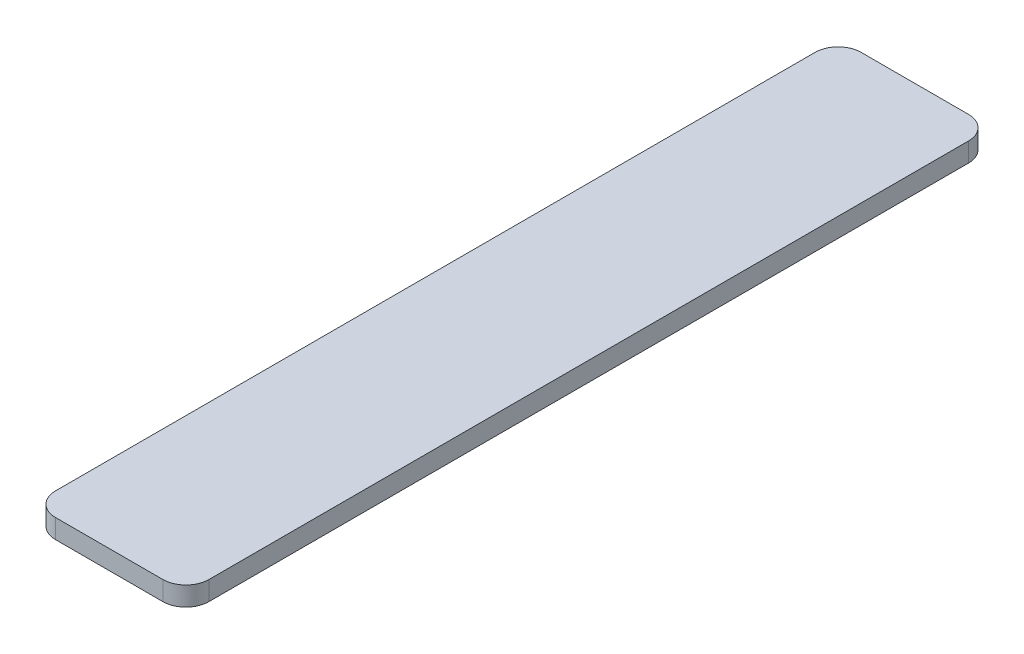
ISO-10303-21;
HEADER;
FILE_DESCRIPTION(('STEP AP214'),'2;1');
FILE_NAME('part.step','',(''),(''),'','','');
FILE_SCHEMA(('AUTOMOTIVE_DESIGN { 1 0 10303 214 1 1 1 1 }'));
ENDSEC;
DATA;
#1=APPLICATION_CONTEXT('core data for automotive mechanical design processes');
#2=APPLICATION_PROTOCOL_DEFINITION('international standard','automotive_design',2000,#1);
#3=PRODUCT_CONTEXT('',#1,'mechanical');
#4=PRODUCT('Part','Part','',(#3));
#5=PRODUCT_RELATED_PRODUCT_CATEGORY('part','',(#4));
#6=PRODUCT_DEFINITION_FORMATION('','',#4);
#7=PRODUCT_DEFINITION_CONTEXT('part definition',#1,'design');
#8=PRODUCT_DEFINITION('design','',#6,#7);
#9=PRODUCT_DEFINITION_SHAPE('','',#8);
#10=(LENGTH_UNIT() NAMED_UNIT(*) SI_UNIT(.MILLI.,.METRE.));
#11=(NAMED_UNIT(*) PLANE_ANGLE_UNIT() SI_UNIT($,.RADIAN.));
#12=(NAMED_UNIT(*) SI_UNIT($,.STERADIAN.) SOLID_ANGLE_UNIT());
#13=UNCERTAINTY_MEASURE_WITH_UNIT(LENGTH_MEASURE(1.E-05),#10,'distance_accuracy_value','');
#14=(GEOMETRIC_REPRESENTATION_CONTEXT(3) GLOBAL_UNCERTAINTY_ASSIGNED_CONTEXT((#13)) GLOBAL_UNIT_ASSIGNED_CONTEXT((#10,
#11,#12)) REPRESENTATION_CONTEXT('',''));
#15=CARTESIAN_POINT('',(0.,0.,0.));
#16=DIRECTION('',(0.,0.,1.));
#17=DIRECTION('',(1.,0.,0.));
#18=AXIS2_PLACEMENT_3D('',#15,#16,#17);
#19=CARTESIAN_POINT('',(-12.7,1.5875,66.675));
#20=DIRECTION('',(1.,0.,0.));
#21=DIRECTION('',(0.,0.,-1.));
#22=AXIS2_PLACEMENT_3D('',#19,#20,#21);
#23=PLANE('',#22);
#24=DIRECTION('',(0.,0.,-1.));
#25=VECTOR('',#24,1.);
#26=CARTESIAN_POINT('',(-12.7,-1.5875,66.675));
#27=LINE('',#26,#25);
#28=CARTESIAN_POINT('',(-12.7,-1.5875,62.865));
#29=VERTEX_POINT('',#28);
#30=CARTESIAN_POINT('',(-12.7,-1.5875,-62.865));
#31=VERTEX_POINT('',#30);
#32=EDGE_CURVE('E12',#29,#31,#27,.T.);
#33=ORIENTED_EDGE('',*,*,#32,.F.);
#34=DIRECTION('',(0.,1.,0.));
#35=VECTOR('',#34,1.);
#36=CARTESIAN_POINT('',(-12.7,-1.5875,62.865));
#37=LINE('',#36,#35);
#38=CARTESIAN_POINT('',(-12.7,1.5875,62.865));
#39=VERTEX_POINT('',#38);
#40=EDGE_CURVE('E131',#29,#39,#37,.T.);
#41=ORIENTED_EDGE('',*,*,#40,.T.);
#42=DIRECTION('',(0.,0.,-1.));
#43=VECTOR('',#42,1.);
#44=CARTESIAN_POINT('',(-12.7,1.5875,66.675));
#45=LINE('',#44,#43);
#46=CARTESIAN_POINT('',(-12.7,1.5875,-62.865));
#47=VERTEX_POINT('',#46);
#48=EDGE_CURVE('E130',#39,#47,#45,.T.);
#49=ORIENTED_EDGE('',*,*,#48,.T.);
#50=DIRECTION('',(0.,1.,0.));
#51=VECTOR('',#50,1.);
#52=CARTESIAN_POINT('',(-12.7,-1.5875,-62.865));
#53=LINE('',#52,#51);
#54=EDGE_CURVE('E116',#31,#47,#53,.T.);
#55=ORIENTED_EDGE('',*,*,#54,.F.);
#56=EDGE_LOOP('',(#33,#41,#49,#55));
#57=FACE_BOUND('',#56,.T.);
#58=ADVANCED_FACE('F50',(#57),#23,.F.);
#59=CARTESIAN_POINT('',(12.7,-1.5875,66.675));
#60=DIRECTION('',(0.,1.,0.));
#61=DIRECTION('',(0.,0.,1.));
#62=AXIS2_PLACEMENT_3D('',#59,#60,#61);
#63=PLANE('',#62);
#64=CARTESIAN_POINT('',(8.89,-1.5875,-62.865));
#65=DIRECTION('',(0.,1.,0.));
#66=DIRECTION('',(0.,0.,1.));
#67=AXIS2_PLACEMENT_3D('',#64,#65,#66);
#68=CIRCLE('',#67,3.81);
#69=CARTESIAN_POINT('',(12.7,-1.5875,-62.865));
#70=VERTEX_POINT('',#69);
#71=CARTESIAN_POINT('',(8.89,-1.5875,-66.675));
#72=VERTEX_POINT('',#71);
#73=EDGE_CURVE('E123',#70,#72,#68,.T.);
#74=ORIENTED_EDGE('',*,*,#73,.F.);
#75=DIRECTION('',(0.,0.,-1.));
#76=VECTOR('',#75,1.);
#77=CARTESIAN_POINT('',(12.7,-1.5875,66.675));
#78=LINE('',#77,#76);
#79=CARTESIAN_POINT('',(12.7,-1.5875,62.865));
#80=VERTEX_POINT('',#79);
#81=EDGE_CURVE('E57',#80,#70,#78,.T.);
#82=ORIENTED_EDGE('',*,*,#81,.F.);
#83=CARTESIAN_POINT('',(8.89,-1.5875,62.865));
#84=DIRECTION('',(0.,1.,0.));
#85=DIRECTION('',(0.,0.,-1.));
#86=AXIS2_PLACEMENT_3D('',#83,#84,#85);
#87=CIRCLE('',#86,3.81);
#88=CARTESIAN_POINT('',(8.88999999999997,-1.5875,66.675));
#89=VERTEX_POINT('',#88);
#90=EDGE_CURVE('E139',#89,#80,#87,.T.);
#91=ORIENTED_EDGE('',*,*,#90,.F.);
#92=DIRECTION('',(1.,0.,0.));
#93=VECTOR('',#92,1.);
#94=CARTESIAN_POINT('',(12.7,-1.5875,66.675));
#95=LINE('',#94,#93);
#96=CARTESIAN_POINT('',(-8.89,-1.5875,66.675));
#97=VERTEX_POINT('',#96);
#98=EDGE_CURVE('E138',#97,#89,#95,.T.);
#99=ORIENTED_EDGE('',*,*,#98,.F.);
#100=CARTESIAN_POINT('',(-8.89,-1.5875,62.865));
#101=DIRECTION('',(0.,1.,0.));
#102=DIRECTION('',(0.,0.,-1.));
#103=AXIS2_PLACEMENT_3D('',#100,#101,#102);
#104=CIRCLE('',#103,3.81);
#105=EDGE_CURVE('E72',#29,#97,#104,.T.);
#106=ORIENTED_EDGE('',*,*,#105,.F.);
#107=ORIENTED_EDGE('',*,*,#32,.T.);
#108=CARTESIAN_POINT('',(-8.89,-1.5875,-62.865));
#109=DIRECTION('',(0.,1.,0.));
#110=DIRECTION('',(0.,0.,1.));
#111=AXIS2_PLACEMENT_3D('',#108,#109,#110);
#112=CIRCLE('',#111,3.81);
#113=CARTESIAN_POINT('',(-8.88999999999997,-1.5875,-66.675));
#114=VERTEX_POINT('',#113);
#115=EDGE_CURVE('E113',#114,#31,#112,.T.);
#116=ORIENTED_EDGE('',*,*,#115,.F.);
#117=DIRECTION('',(1.,0.,0.));
#118=VECTOR('',#117,1.);
#119=CARTESIAN_POINT('',(12.7,-1.5875,-66.675));
#120=LINE('',#119,#118);
#121=EDGE_CURVE('E157',#114,#72,#120,.T.);
#122=ORIENTED_EDGE('',*,*,#121,.T.);
#123=EDGE_LOOP('',(#74,#82,#91,#99,#106,#107,#116,#122));
#124=FACE_BOUND('',#123,.T.);
#125=ADVANCED_FACE('F134',(#124),#63,.F.);
#126=CARTESIAN_POINT('',(12.7,1.5875,66.675));
#127=DIRECTION('',(-1.,0.,0.));
#128=DIRECTION('',(0.,0.,1.));
#129=AXIS2_PLACEMENT_3D('',#126,#127,#128);
#130=PLANE('',#129);
#131=ORIENTED_EDGE('',*,*,#81,.T.);
#132=DIRECTION('',(0.,1.,0.));
#133=VECTOR('',#132,1.);
#134=CARTESIAN_POINT('',(12.7,-1.5875,-62.865));
#135=LINE('',#134,#133);
#136=CARTESIAN_POINT('',(12.7,1.5875,-62.865));
#137=VERTEX_POINT('',#136);
#138=EDGE_CURVE('E154',#70,#137,#135,.T.);
#139=ORIENTED_EDGE('',*,*,#138,.T.);
#140=DIRECTION('',(0.,0.,-1.));
#141=VECTOR('',#140,1.);
#142=CARTESIAN_POINT('',(12.7,1.5875,66.675));
#143=LINE('',#142,#141);
#144=CARTESIAN_POINT('',(12.7,1.5875,62.865));
#145=VERTEX_POINT('',#144);
#146=EDGE_CURVE('E176',#145,#137,#143,.T.);
#147=ORIENTED_EDGE('',*,*,#146,.F.);
#148=DIRECTION('',(0.,1.,0.));
#149=VECTOR('',#148,1.);
#150=CARTESIAN_POINT('',(12.7,-1.5875,62.865));
#151=LINE('',#150,#149);
#152=EDGE_CURVE('E158',#80,#145,#151,.T.);
#153=ORIENTED_EDGE('',*,*,#152,.F.);
#154=EDGE_LOOP('',(#131,#139,#147,#153));
#155=FACE_BOUND('',#154,.T.);
#156=ADVANCED_FACE('F182',(#155),#130,.F.);
#157=CARTESIAN_POINT('',(12.7,1.5875,66.675));
#158=DIRECTION('',(0.,-1.,0.));
#159=DIRECTION('',(0.,0.,-1.));
#160=AXIS2_PLACEMENT_3D('',#157,#158,#159);
#161=PLANE('',#160);
#162=CARTESIAN_POINT('',(8.89,1.5875,-62.865));
#163=DIRECTION('',(0.,1.,0.));
#164=DIRECTION('',(0.,0.,1.));
#165=AXIS2_PLACEMENT_3D('',#162,#163,#164);
#166=CIRCLE('',#165,3.81);
#167=CARTESIAN_POINT('',(8.88999999999997,1.5875,-66.675));
#168=VERTEX_POINT('',#167);
#169=EDGE_CURVE('E145',#137,#168,#166,.T.);
#170=ORIENTED_EDGE('',*,*,#169,.T.);
#171=DIRECTION('',(-1.,0.,0.));
#172=VECTOR('',#171,1.);
#173=CARTESIAN_POINT('',(12.7,1.5875,-66.675));
#174=LINE('',#173,#172);
#175=CARTESIAN_POINT('',(-8.89,1.5875,-66.675));
#176=VERTEX_POINT('',#175);
#177=EDGE_CURVE('E168',#168,#176,#174,.T.);
#178=ORIENTED_EDGE('',*,*,#177,.T.);
#179=CARTESIAN_POINT('',(-8.89,1.5875,-62.865));
#180=DIRECTION('',(0.,1.,0.));
#181=DIRECTION('',(0.,0.,1.));
#182=AXIS2_PLACEMENT_3D('',#179,#180,#181);
#183=CIRCLE('',#182,3.81);
#184=EDGE_CURVE('E148',#176,#47,#183,.T.);
#185=ORIENTED_EDGE('',*,*,#184,.T.);
#186=ORIENTED_EDGE('',*,*,#48,.F.);
#187=CARTESIAN_POINT('',(-8.89,1.5875,62.865));
#188=DIRECTION('',(0.,1.,0.));
#189=DIRECTION('',(0.,0.,-1.));
#190=AXIS2_PLACEMENT_3D('',#187,#188,#189);
#191=CIRCLE('',#190,3.81);
#192=CARTESIAN_POINT('',(-8.88999999999997,1.5875,66.675));
#193=VERTEX_POINT('',#192);
#194=EDGE_CURVE('E150',#39,#193,#191,.T.);
#195=ORIENTED_EDGE('',*,*,#194,.T.);
#196=DIRECTION('',(-1.,0.,0.));
#197=VECTOR('',#196,1.);
#198=CARTESIAN_POINT('',(12.7,1.5875,66.675));
#199=LINE('',#198,#197);
#200=CARTESIAN_POINT('',(8.89,1.5875,66.675));
#201=VERTEX_POINT('',#200);
#202=EDGE_CURVE('E172',#201,#193,#199,.T.);
#203=ORIENTED_EDGE('',*,*,#202,.F.);
#204=CARTESIAN_POINT('',(8.89,1.5875,62.865));
#205=DIRECTION('',(0.,1.,0.));
#206=DIRECTION('',(0.,0.,-1.));
#207=AXIS2_PLACEMENT_3D('',#204,#205,#206);
#208=CIRCLE('',#207,3.81);
#209=EDGE_CURVE('E64',#201,#145,#208,.T.);
#210=ORIENTED_EDGE('',*,*,#209,.T.);
#211=ORIENTED_EDGE('',*,*,#146,.T.);
#212=EDGE_LOOP('',(#170,#178,#185,#186,#195,#203,#210,#211));
#213=FACE_BOUND('',#212,.T.);
#214=ADVANCED_FACE('F191',(#213),#161,.F.);
#215=CARTESIAN_POINT('',(0.,0.,66.675));
#216=DIRECTION('',(0.,0.,-1.));
#217=DIRECTION('',(-1.,0.,0.));
#218=AXIS2_PLACEMENT_3D('',#215,#216,#217);
#219=PLANE('',#218);
#220=ORIENTED_EDGE('',*,*,#98,.T.);
#221=DIRECTION('',(0.,1.,0.));
#222=VECTOR('',#221,1.);
#223=CARTESIAN_POINT('',(8.88999999999997,-1.5875,66.675));
#224=LINE('',#223,#222);
#225=EDGE_CURVE('E160',#89,#201,#224,.T.);
#226=ORIENTED_EDGE('',*,*,#225,.T.);
#227=ORIENTED_EDGE('',*,*,#202,.T.);
#228=DIRECTION('',(0.,1.,0.));
#229=VECTOR('',#228,1.);
#230=CARTESIAN_POINT('',(-8.88999999999997,-1.5875,66.675));
#231=LINE('',#230,#229);
#232=EDGE_CURVE('E162',#97,#193,#231,.T.);
#233=ORIENTED_EDGE('',*,*,#232,.F.);
#234=EDGE_LOOP('',(#220,#226,#227,#233));
#235=FACE_BOUND('',#234,.T.);
#236=ADVANCED_FACE('F194',(#235),#219,.F.);
#237=CARTESIAN_POINT('',(0.,0.,-66.675));
#238=DIRECTION('',(0.,0.,-1.));
#239=DIRECTION('',(-1.,0.,0.));
#240=AXIS2_PLACEMENT_3D('',#237,#238,#239);
#241=PLANE('',#240);
#242=DIRECTION('',(0.,1.,0.));
#243=VECTOR('',#242,1.);
#244=CARTESIAN_POINT('',(8.88999999999997,-1.5875,-66.675));
#245=LINE('',#244,#243);
#246=EDGE_CURVE('E141',#72,#168,#245,.T.);
#247=ORIENTED_EDGE('',*,*,#246,.F.);
#248=ORIENTED_EDGE('',*,*,#121,.F.);
#249=DIRECTION('',(0.,1.,0.));
#250=VECTOR('',#249,1.);
#251=CARTESIAN_POINT('',(-8.88999999999997,-1.5875,-66.675));
#252=LINE('',#251,#250);
#253=EDGE_CURVE('E119',#114,#176,#252,.T.);
#254=ORIENTED_EDGE('',*,*,#253,.T.);
#255=ORIENTED_EDGE('',*,*,#177,.F.);
#256=EDGE_LOOP('',(#247,#248,#254,#255));
#257=FACE_BOUND('',#256,.T.);
#258=ADVANCED_FACE('F189',(#257),#241,.T.);
#259=CARTESIAN_POINT('',(-8.89,-1.5875,-62.865));
#260=DIRECTION('',(0.,1.,0.));
#261=DIRECTION('',(0.,0.,1.));
#262=AXIS2_PLACEMENT_3D('',#259,#260,#261);
#263=CYLINDRICAL_SURFACE('',#262,3.81);
#264=ORIENTED_EDGE('',*,*,#184,.F.);
#265=ORIENTED_EDGE('',*,*,#253,.F.);
#266=ORIENTED_EDGE('',*,*,#115,.T.);
#267=ORIENTED_EDGE('',*,*,#54,.T.);
#268=EDGE_LOOP('',(#264,#265,#266,#267));
#269=FACE_BOUND('',#268,.T.);
#270=ADVANCED_FACE('F115',(#269),#263,.T.);
#271=CARTESIAN_POINT('',(8.89,-1.5875,-62.865));
#272=DIRECTION('',(0.,1.,0.));
#273=DIRECTION('',(0.,0.,1.));
#274=AXIS2_PLACEMENT_3D('',#271,#272,#273);
#275=CYLINDRICAL_SURFACE('',#274,3.81);
#276=ORIENTED_EDGE('',*,*,#169,.F.);
#277=ORIENTED_EDGE('',*,*,#138,.F.);
#278=ORIENTED_EDGE('',*,*,#73,.T.);
#279=ORIENTED_EDGE('',*,*,#246,.T.);
#280=EDGE_LOOP('',(#276,#277,#278,#279));
#281=FACE_BOUND('',#280,.T.);
#282=ADVANCED_FACE('F186',(#281),#275,.T.);
#283=CARTESIAN_POINT('',(-8.89,-1.5875,62.865));
#284=DIRECTION('',(0.,1.,0.));
#285=DIRECTION('',(0.,0.,1.));
#286=AXIS2_PLACEMENT_3D('',#283,#284,#285);
#287=CYLINDRICAL_SURFACE('',#286,3.81);
#288=ORIENTED_EDGE('',*,*,#194,.F.);
#289=ORIENTED_EDGE('',*,*,#40,.F.);
#290=ORIENTED_EDGE('',*,*,#105,.T.);
#291=ORIENTED_EDGE('',*,*,#232,.T.);
#292=EDGE_LOOP('',(#288,#289,#290,#291));
#293=FACE_BOUND('',#292,.T.);
#294=ADVANCED_FACE('F197',(#293),#287,.T.);
#295=CARTESIAN_POINT('',(8.89,-1.5875,62.865));
#296=DIRECTION('',(0.,1.,0.));
#297=DIRECTION('',(0.,0.,1.));
#298=AXIS2_PLACEMENT_3D('',#295,#296,#297);
#299=CYLINDRICAL_SURFACE('',#298,3.81);
#300=ORIENTED_EDGE('',*,*,#209,.F.);
#301=ORIENTED_EDGE('',*,*,#225,.F.);
#302=ORIENTED_EDGE('',*,*,#90,.T.);
#303=ORIENTED_EDGE('',*,*,#152,.T.);
#304=EDGE_LOOP('',(#300,#301,#302,#303));
#305=FACE_BOUND('',#304,.T.);
#306=ADVANCED_FACE('F195',(#305),#299,.T.);
#307=CLOSED_SHELL('',(#58,#125,#156,#214,#236,#258,#270,#282,#294,#306));
#308=MANIFOLD_SOLID_BREP('B2',#307);
#309=ADVANCED_BREP_SHAPE_REPRESENTATION('',(#18,#308),#14);
#310=SHAPE_DEFINITION_REPRESENTATION(#9,#309);
ENDSEC;
END-ISO-10303-21;
